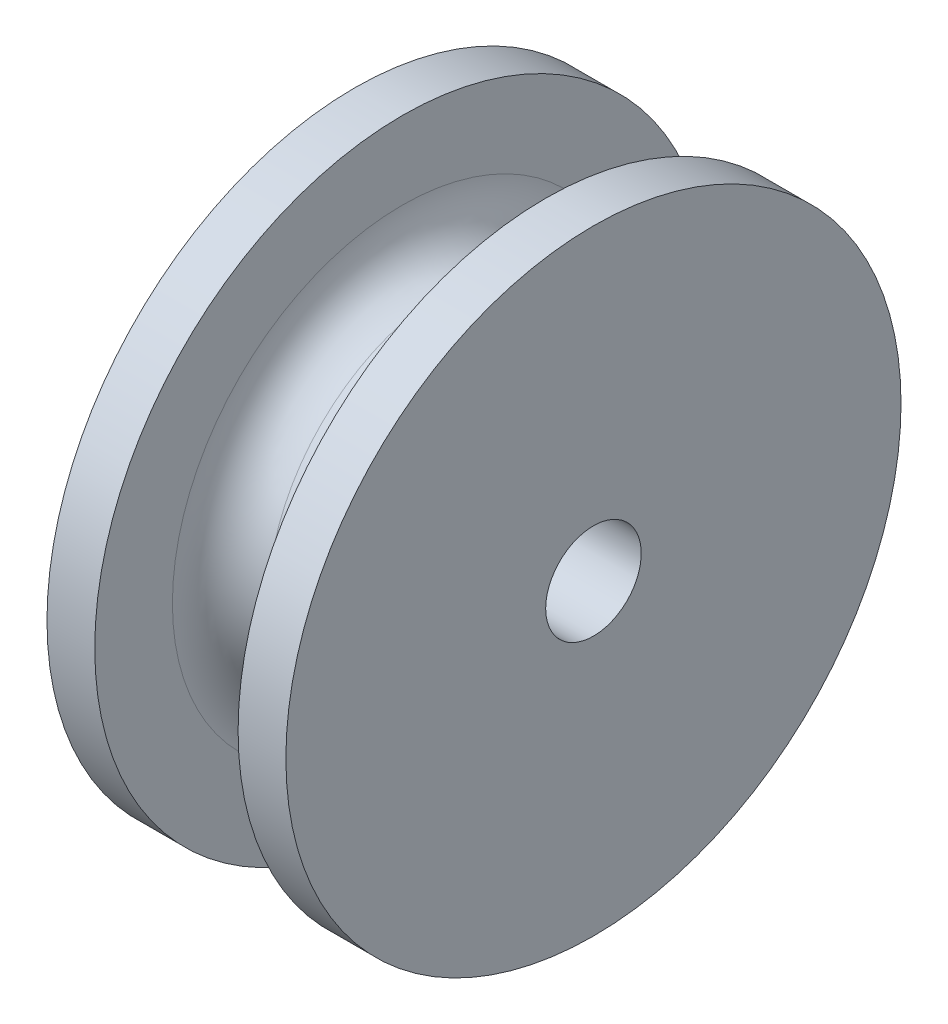
ISO-10303-21;
HEADER;
FILE_DESCRIPTION(('STEP AP214'),'2;1');
FILE_NAME('part.step','',(''),(''),'','','');
FILE_SCHEMA(('AUTOMOTIVE_DESIGN { 1 0 10303 214 1 1 1 1 }'));
ENDSEC;
DATA;
#1=APPLICATION_CONTEXT('core data for automotive mechanical design processes');
#2=APPLICATION_PROTOCOL_DEFINITION('international standard','automotive_design',2000,#1);
#3=PRODUCT_CONTEXT('',#1,'mechanical');
#4=PRODUCT('Part','Part','',(#3));
#5=PRODUCT_RELATED_PRODUCT_CATEGORY('part','',(#4));
#6=PRODUCT_DEFINITION_FORMATION('','',#4);
#7=PRODUCT_DEFINITION_CONTEXT('part definition',#1,'design');
#8=PRODUCT_DEFINITION('design','',#6,#7);
#9=PRODUCT_DEFINITION_SHAPE('','',#8);
#10=(LENGTH_UNIT() NAMED_UNIT(*) SI_UNIT(.MILLI.,.METRE.));
#11=(NAMED_UNIT(*) PLANE_ANGLE_UNIT() SI_UNIT($,.RADIAN.));
#12=(NAMED_UNIT(*) SI_UNIT($,.STERADIAN.) SOLID_ANGLE_UNIT());
#13=UNCERTAINTY_MEASURE_WITH_UNIT(LENGTH_MEASURE(1.E-05),#10,'distance_accuracy_value','');
#14=(GEOMETRIC_REPRESENTATION_CONTEXT(3) GLOBAL_UNCERTAINTY_ASSIGNED_CONTEXT((#13)) GLOBAL_UNIT_ASSIGNED_CONTEXT((#10,
#11,#12)) REPRESENTATION_CONTEXT('',''));
#15=CARTESIAN_POINT('',(0.,0.,0.));
#16=DIRECTION('',(0.,0.,1.));
#17=DIRECTION('',(1.,0.,0.));
#18=AXIS2_PLACEMENT_3D('',#15,#16,#17);
#19=CARTESIAN_POINT('',(-10.,0.,0.));
#20=DIRECTION('',(1.,0.,0.));
#21=DIRECTION('',(0.,0.,-1.));
#22=AXIS2_PLACEMENT_3D('',#19,#20,#21);
#23=PLANE('',#22);
#24=CARTESIAN_POINT('',(-10.,0.,0.));
#25=DIRECTION('',(-1.,0.,0.));
#26=DIRECTION('',(0.,0.,1.));
#27=AXIS2_PLACEMENT_3D('',#24,#25,#26);
#28=CIRCLE('',#27,4.);
#29=CARTESIAN_POINT('',(-10.,0.,4.));
#30=VERTEX_POINT('',#29);
#31=EDGE_CURVE('E70',#30,#30,#28,.T.);
#32=ORIENTED_EDGE('',*,*,#31,.F.);
#33=EDGE_LOOP('',(#32));
#34=FACE_BOUND('',#33,.T.);
#35=CARTESIAN_POINT('',(-10.,0.,0.));
#36=DIRECTION('',(1.,0.,0.));
#37=DIRECTION('',(0.,0.,-1.));
#38=AXIS2_PLACEMENT_3D('',#35,#36,#37);
#39=CIRCLE('',#38,25.75);
#40=CARTESIAN_POINT('',(-10.,0.,-25.75));
#41=VERTEX_POINT('',#40);
#42=EDGE_CURVE('E57',#41,#41,#39,.T.);
#43=ORIENTED_EDGE('',*,*,#42,.F.);
#44=EDGE_LOOP('',(#43));
#45=FACE_BOUND('',#44,.T.);
#46=ADVANCED_FACE('F37',(#34,#45),#23,.F.);
#47=CARTESIAN_POINT('',(10.,0.,0.));
#48=DIRECTION('',(1.,0.,0.));
#49=DIRECTION('',(0.,0.,-1.));
#50=AXIS2_PLACEMENT_3D('',#47,#48,#49);
#51=CYLINDRICAL_SURFACE('',#50,25.75);
#52=CARTESIAN_POINT('',(-6.,0.,0.));
#53=DIRECTION('',(1.,0.,0.));
#54=DIRECTION('',(0.,0.,-1.));
#55=AXIS2_PLACEMENT_3D('',#52,#53,#54);
#56=CIRCLE('',#55,25.75);
#57=CARTESIAN_POINT('',(-6.,0.,-25.75));
#58=VERTEX_POINT('',#57);
#59=EDGE_CURVE('E60',#58,#58,#56,.T.);
#60=ORIENTED_EDGE('',*,*,#59,.F.);
#61=EDGE_LOOP('',(#60));
#62=FACE_BOUND('',#61,.T.);
#63=ORIENTED_EDGE('',*,*,#42,.T.);
#64=EDGE_LOOP('',(#63));
#65=FACE_BOUND('',#64,.T.);
#66=ADVANCED_FACE('F87',(#62,#65),#51,.T.);
#67=CARTESIAN_POINT('',(-6.,0.,25.75));
#68=DIRECTION('',(-1.,0.,0.));
#69=DIRECTION('',(0.,0.,1.));
#70=AXIS2_PLACEMENT_3D('',#67,#68,#69);
#71=PLANE('',#70);
#72=CARTESIAN_POINT('',(-6.,0.,0.));
#73=DIRECTION('',(-1.,0.,0.));
#74=DIRECTION('',(0.,0.,1.));
#75=AXIS2_PLACEMENT_3D('',#72,#73,#74);
#76=CIRCLE('',#75,19.25);
#77=CARTESIAN_POINT('',(-6.,0.,19.25));
#78=VERTEX_POINT('',#77);
#79=EDGE_CURVE('E44',#78,#78,#76,.T.);
#80=ORIENTED_EDGE('',*,*,#79,.T.);
#81=EDGE_LOOP('',(#80));
#82=FACE_BOUND('',#81,.T.);
#83=ORIENTED_EDGE('',*,*,#59,.T.);
#84=EDGE_LOOP('',(#83));
#85=FACE_BOUND('',#84,.T.);
#86=ADVANCED_FACE('F92',(#82,#85),#71,.F.);
#87=CARTESIAN_POINT('',(10.,0.,0.));
#88=DIRECTION('',(1.,0.,0.));
#89=DIRECTION('',(0.,0.,-1.));
#90=AXIS2_PLACEMENT_3D('',#87,#88,#89);
#91=CYLINDRICAL_SURFACE('',#90,15.25);
#92=CARTESIAN_POINT('',(-2.,0.,0.));
#93=DIRECTION('',(-1.,0.,0.));
#94=DIRECTION('',(0.,0.,1.));
#95=AXIS2_PLACEMENT_3D('',#92,#93,#94);
#96=CIRCLE('',#95,15.25);
#97=CARTESIAN_POINT('',(-2.,0.,15.25));
#98=VERTEX_POINT('',#97);
#99=EDGE_CURVE('E48',#98,#98,#96,.F.);
#100=ORIENTED_EDGE('',*,*,#99,.T.);
#101=EDGE_LOOP('',(#100));
#102=FACE_BOUND('',#101,.T.);
#103=CARTESIAN_POINT('',(1.99999999999999,0.,0.));
#104=DIRECTION('',(1.,0.,0.));
#105=DIRECTION('',(0.,0.,-1.));
#106=AXIS2_PLACEMENT_3D('',#103,#104,#105);
#107=CIRCLE('',#106,15.25);
#108=CARTESIAN_POINT('',(1.99999999999999,0.,-15.25));
#109=VERTEX_POINT('',#108);
#110=EDGE_CURVE('E52',#109,#109,#107,.F.);
#111=ORIENTED_EDGE('',*,*,#110,.T.);
#112=EDGE_LOOP('',(#111));
#113=FACE_BOUND('',#112,.T.);
#114=ADVANCED_FACE('F99',(#102,#113),#91,.T.);
#115=CARTESIAN_POINT('',(6.,0.,25.75));
#116=DIRECTION('',(1.,0.,0.));
#117=DIRECTION('',(0.,0.,-1.));
#118=AXIS2_PLACEMENT_3D('',#115,#116,#117);
#119=PLANE('',#118);
#120=CARTESIAN_POINT('',(6.,0.,0.));
#121=DIRECTION('',(1.,0.,0.));
#122=DIRECTION('',(0.,0.,-1.));
#123=AXIS2_PLACEMENT_3D('',#120,#121,#122);
#124=CIRCLE('',#123,19.25);
#125=CARTESIAN_POINT('',(5.99999999999999,0.,-19.25));
#126=VERTEX_POINT('',#125);
#127=EDGE_CURVE('E10',#126,#126,#124,.T.);
#128=ORIENTED_EDGE('',*,*,#127,.T.);
#129=EDGE_LOOP('',(#128));
#130=FACE_BOUND('',#129,.T.);
#131=CARTESIAN_POINT('',(5.99999999999999,0.,0.));
#132=DIRECTION('',(1.,0.,0.));
#133=DIRECTION('',(0.,0.,-1.));
#134=AXIS2_PLACEMENT_3D('',#131,#132,#133);
#135=CIRCLE('',#134,25.75);
#136=CARTESIAN_POINT('',(5.99999999999999,0.,-25.75));
#137=VERTEX_POINT('',#136);
#138=EDGE_CURVE('E63',#137,#137,#135,.T.);
#139=ORIENTED_EDGE('',*,*,#138,.F.);
#140=EDGE_LOOP('',(#139));
#141=FACE_BOUND('',#140,.T.);
#142=ADVANCED_FACE('F119',(#130,#141),#119,.F.);
#143=CARTESIAN_POINT('',(10.,0.,0.));
#144=DIRECTION('',(1.,0.,0.));
#145=DIRECTION('',(0.,0.,-1.));
#146=AXIS2_PLACEMENT_3D('',#143,#144,#145);
#147=CYLINDRICAL_SURFACE('',#146,25.75);
#148=CARTESIAN_POINT('',(9.99999999999999,0.,0.));
#149=DIRECTION('',(1.,0.,0.));
#150=DIRECTION('',(0.,0.,-1.));
#151=AXIS2_PLACEMENT_3D('',#148,#149,#150);
#152=CIRCLE('',#151,25.75);
#153=CARTESIAN_POINT('',(9.99999999999999,0.,-25.75));
#154=VERTEX_POINT('',#153);
#155=EDGE_CURVE('E66',#154,#154,#152,.T.);
#156=ORIENTED_EDGE('',*,*,#155,.F.);
#157=EDGE_LOOP('',(#156));
#158=FACE_BOUND('',#157,.T.);
#159=ORIENTED_EDGE('',*,*,#138,.T.);
#160=EDGE_LOOP('',(#159));
#161=FACE_BOUND('',#160,.T.);
#162=ADVANCED_FACE('F112',(#158,#161),#147,.T.);
#163=CARTESIAN_POINT('',(10.,0.,0.));
#164=DIRECTION('',(-1.,0.,0.));
#165=DIRECTION('',(0.,0.,1.));
#166=AXIS2_PLACEMENT_3D('',#163,#164,#165);
#167=PLANE('',#166);
#168=CARTESIAN_POINT('',(9.99999999999999,0.,0.));
#169=DIRECTION('',(-1.,0.,0.));
#170=DIRECTION('',(0.,0.,1.));
#171=AXIS2_PLACEMENT_3D('',#168,#169,#170);
#172=CIRCLE('',#171,4.);
#173=CARTESIAN_POINT('',(9.99999999999999,0.,4.));
#174=VERTEX_POINT('',#173);
#175=EDGE_CURVE('E69',#174,#174,#172,.T.);
#176=ORIENTED_EDGE('',*,*,#175,.T.);
#177=EDGE_LOOP('',(#176));
#178=FACE_BOUND('',#177,.T.);
#179=ORIENTED_EDGE('',*,*,#155,.T.);
#180=EDGE_LOOP('',(#179));
#181=FACE_BOUND('',#180,.T.);
#182=ADVANCED_FACE('F76',(#178,#181),#167,.F.);
#183=CARTESIAN_POINT('',(-2.,0.,0.));
#184=DIRECTION('',(-1.,0.,0.));
#185=DIRECTION('',(0.,0.,1.));
#186=AXIS2_PLACEMENT_3D('',#183,#184,#185);
#187=TOROIDAL_SURFACE('',#186,19.25,4.);
#188=ORIENTED_EDGE('',*,*,#79,.F.);
#189=EDGE_LOOP('',(#188));
#190=FACE_BOUND('',#189,.T.);
#191=ORIENTED_EDGE('',*,*,#99,.F.);
#192=EDGE_LOOP('',(#191));
#193=FACE_BOUND('',#192,.T.);
#194=ADVANCED_FACE('F103',(#190,#193),#187,.F.);
#195=CARTESIAN_POINT('',(1.99999999999999,0.,0.));
#196=DIRECTION('',(1.,0.,0.));
#197=DIRECTION('',(0.,0.,-1.));
#198=AXIS2_PLACEMENT_3D('',#195,#196,#197);
#199=TOROIDAL_SURFACE('',#198,19.25,4.);
#200=ORIENTED_EDGE('',*,*,#110,.F.);
#201=EDGE_LOOP('',(#200));
#202=FACE_BOUND('',#201,.T.);
#203=ORIENTED_EDGE('',*,*,#127,.F.);
#204=EDGE_LOOP('',(#203));
#205=FACE_BOUND('',#204,.T.);
#206=ADVANCED_FACE('F39',(#202,#205),#199,.F.);
#207=CARTESIAN_POINT('',(9.99999999999999,0.,0.));
#208=DIRECTION('',(-1.,0.,0.));
#209=DIRECTION('',(0.,0.,1.));
#210=AXIS2_PLACEMENT_3D('',#207,#208,#209);
#211=CYLINDRICAL_SURFACE('',#210,4.);
#212=ORIENTED_EDGE('',*,*,#175,.F.);
#213=EDGE_LOOP('',(#212));
#214=FACE_BOUND('',#213,.T.);
#215=ORIENTED_EDGE('',*,*,#31,.T.);
#216=EDGE_LOOP('',(#215));
#217=FACE_BOUND('',#216,.T.);
#218=ADVANCED_FACE('F79',(#214,#217),#211,.F.);
#219=CLOSED_SHELL('',(#46,#66,#86,#114,#142,#162,#182,#194,#206,#218));
#220=MANIFOLD_SOLID_BREP('B2',#219);
#221=ADVANCED_BREP_SHAPE_REPRESENTATION('',(#18,#220),#14);
#222=SHAPE_DEFINITION_REPRESENTATION(#9,#221);
ENDSEC;
END-ISO-10303-21;
